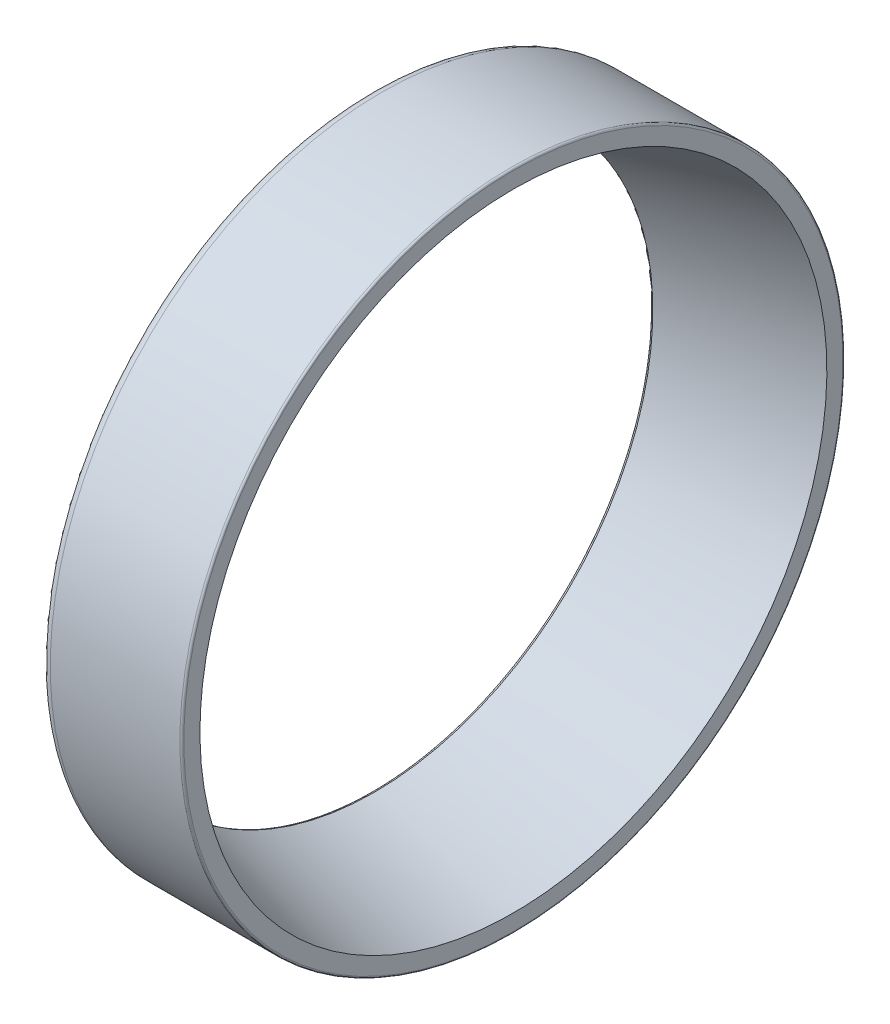
ISO-10303-21;
HEADER;
FILE_DESCRIPTION(('STEP AP214'),'2;1');
FILE_NAME('part.step','',(''),(''),'','','');
FILE_SCHEMA(('AUTOMOTIVE_DESIGN { 1 0 10303 214 1 1 1 1 }'));
ENDSEC;
DATA;
#1=APPLICATION_CONTEXT('core data for automotive mechanical design processes');
#2=APPLICATION_PROTOCOL_DEFINITION('international standard','automotive_design',2000,#1);
#3=PRODUCT_CONTEXT('',#1,'mechanical');
#4=PRODUCT('Part','Part','',(#3));
#5=PRODUCT_RELATED_PRODUCT_CATEGORY('part','',(#4));
#6=PRODUCT_DEFINITION_FORMATION('','',#4);
#7=PRODUCT_DEFINITION_CONTEXT('part definition',#1,'design');
#8=PRODUCT_DEFINITION('design','',#6,#7);
#9=PRODUCT_DEFINITION_SHAPE('','',#8);
#10=(LENGTH_UNIT() NAMED_UNIT(*) SI_UNIT(.MILLI.,.METRE.));
#11=(NAMED_UNIT(*) PLANE_ANGLE_UNIT() SI_UNIT($,.RADIAN.));
#12=(NAMED_UNIT(*) SI_UNIT($,.STERADIAN.) SOLID_ANGLE_UNIT());
#13=UNCERTAINTY_MEASURE_WITH_UNIT(LENGTH_MEASURE(1.E-05),#10,'distance_accuracy_value','');
#14=(GEOMETRIC_REPRESENTATION_CONTEXT(3) GLOBAL_UNCERTAINTY_ASSIGNED_CONTEXT((#13)) GLOBAL_UNIT_ASSIGNED_CONTEXT((#10,
#11,#12)) REPRESENTATION_CONTEXT('',''));
#15=CARTESIAN_POINT('',(0.,0.,0.));
#16=DIRECTION('',(0.,0.,1.));
#17=DIRECTION('',(1.,0.,0.));
#18=AXIS2_PLACEMENT_3D('',#15,#16,#17);
#19=CARTESIAN_POINT('',(0.2,0.,0.));
#20=DIRECTION('',(1.,0.,0.));
#21=DIRECTION('',(0.,0.,-1.));
#22=AXIS2_PLACEMENT_3D('',#19,#20,#21);
#23=TOROIDAL_SURFACE('',#22,28.7446378831043,0.2);
#24=CARTESIAN_POINT('',(0.248949796956785,0.,0.));
#25=DIRECTION('',(1.,0.,0.));
#26=DIRECTION('',(0.,1.,0.));
#27=AXIS2_PLACEMENT_3D('',#24,#25,#26);
#28=CIRCLE('',#27,28.5507205879038);
#29=CARTESIAN_POINT('',(0.248949796956785,28.5507205879038,0.));
#30=VERTEX_POINT('',#29);
#31=EDGE_CURVE('E11',#30,#30,#28,.T.);
#32=ORIENTED_EDGE('',*,*,#31,.T.);
#33=EDGE_LOOP('',(#32));
#34=FACE_BOUND('',#33,.T.);
#35=CARTESIAN_POINT('',(0.,0.,0.));
#36=DIRECTION('',(1.,0.,0.));
#37=DIRECTION('',(0.,1.,0.));
#38=AXIS2_PLACEMENT_3D('',#35,#36,#37);
#39=CIRCLE('',#38,28.7446378831043);
#40=CARTESIAN_POINT('',(0.,28.7446378831043,0.));
#41=VERTEX_POINT('',#40);
#42=EDGE_CURVE('E40',#41,#41,#39,.T.);
#43=ORIENTED_EDGE('',*,*,#42,.F.);
#44=EDGE_LOOP('',(#43));
#45=FACE_BOUND('',#44,.T.);
#46=ADVANCED_FACE('F17',(#34,#45),#23,.T.);
#47=CARTESIAN_POINT('',(7.37447489847839,0.,0.));
#48=DIRECTION('',(1.,0.,0.));
#49=DIRECTION('',(0.,1.,0.));
#50=AXIS2_PLACEMENT_3D('',#47,#48,#49);
#51=CONICAL_SURFACE('',#50,30.3493894821314,0.247260795130037);
#52=CARTESIAN_POINT('',(14.5,0.,0.));
#53=DIRECTION('',(1.,0.,0.));
#54=DIRECTION('',(0.,1.,0.));
#55=AXIS2_PLACEMENT_3D('',#52,#53,#54);
#56=CIRCLE('',#55,32.1480583763591);
#57=CARTESIAN_POINT('',(14.5,32.1480583763591,0.));
#58=VERTEX_POINT('',#57);
#59=EDGE_CURVE('E26',#58,#58,#56,.T.);
#60=ORIENTED_EDGE('',*,*,#59,.T.);
#61=EDGE_LOOP('',(#60));
#62=FACE_BOUND('',#61,.T.);
#63=ORIENTED_EDGE('',*,*,#31,.F.);
#64=EDGE_LOOP('',(#63));
#65=FACE_BOUND('',#64,.T.);
#66=ADVANCED_FACE('F19',(#62,#65),#51,.F.);
#67=CARTESIAN_POINT('',(14.5,32.9740291881795,0.));
#68=DIRECTION('',(1.,0.,0.));
#69=DIRECTION('',(0.,1.,0.));
#70=AXIS2_PLACEMENT_3D('',#67,#68,#69);
#71=PLANE('',#70);
#72=CARTESIAN_POINT('',(14.5,0.,0.));
#73=DIRECTION('',(1.,0.,0.));
#74=DIRECTION('',(0.,1.,0.));
#75=AXIS2_PLACEMENT_3D('',#72,#73,#74);
#76=CIRCLE('',#75,33.8);
#77=CARTESIAN_POINT('',(14.5,33.8,0.));
#78=VERTEX_POINT('',#77);
#79=EDGE_CURVE('E58',#78,#78,#76,.T.);
#80=ORIENTED_EDGE('',*,*,#79,.T.);
#81=EDGE_LOOP('',(#80));
#82=FACE_BOUND('',#81,.T.);
#83=ORIENTED_EDGE('',*,*,#59,.F.);
#84=EDGE_LOOP('',(#83));
#85=FACE_BOUND('',#84,.T.);
#86=ADVANCED_FACE('F83',(#82,#85),#71,.T.);
#87=CARTESIAN_POINT('',(14.3,0.,0.));
#88=DIRECTION('',(1.,0.,0.));
#89=DIRECTION('',(0.,0.,-1.));
#90=AXIS2_PLACEMENT_3D('',#87,#88,#89);
#91=TOROIDAL_SURFACE('',#90,33.8,0.2);
#92=CARTESIAN_POINT('',(14.3,0.,0.));
#93=DIRECTION('',(1.,0.,0.));
#94=DIRECTION('',(0.,1.,0.));
#95=AXIS2_PLACEMENT_3D('',#92,#93,#94);
#96=CIRCLE('',#95,34.);
#97=CARTESIAN_POINT('',(14.3,34.,0.));
#98=VERTEX_POINT('',#97);
#99=EDGE_CURVE('E56',#98,#98,#96,.T.);
#100=ORIENTED_EDGE('',*,*,#99,.T.);
#101=EDGE_LOOP('',(#100));
#102=FACE_BOUND('',#101,.T.);
#103=ORIENTED_EDGE('',*,*,#79,.F.);
#104=EDGE_LOOP('',(#103));
#105=FACE_BOUND('',#104,.T.);
#106=ADVANCED_FACE('F76',(#102,#105),#91,.T.);
#107=CARTESIAN_POINT('',(7.65,0.,0.));
#108=DIRECTION('',(-1.,0.,0.));
#109=DIRECTION('',(0.,1.,0.));
#110=AXIS2_PLACEMENT_3D('',#107,#108,#109);
#111=CYLINDRICAL_SURFACE('',#110,34.);
#112=CARTESIAN_POINT('',(1.,0.,0.));
#113=DIRECTION('',(1.,0.,0.));
#114=DIRECTION('',(0.,1.,0.));
#115=AXIS2_PLACEMENT_3D('',#112,#113,#114);
#116=CIRCLE('',#115,34.);
#117=CARTESIAN_POINT('',(1.,34.,0.));
#118=VERTEX_POINT('',#117);
#119=EDGE_CURVE('E52',#118,#118,#116,.T.);
#120=ORIENTED_EDGE('',*,*,#119,.T.);
#121=EDGE_LOOP('',(#120));
#122=FACE_BOUND('',#121,.T.);
#123=ORIENTED_EDGE('',*,*,#99,.F.);
#124=EDGE_LOOP('',(#123));
#125=FACE_BOUND('',#124,.T.);
#126=ADVANCED_FACE('F65',(#122,#125),#111,.T.);
#127=CARTESIAN_POINT('',(1.,0.,0.));
#128=DIRECTION('',(1.,0.,0.));
#129=DIRECTION('',(0.,0.,-1.));
#130=AXIS2_PLACEMENT_3D('',#127,#128,#129);
#131=TOROIDAL_SURFACE('',#130,33.,1.);
#132=CARTESIAN_POINT('',(0.,0.,0.));
#133=DIRECTION('',(1.,0.,0.));
#134=DIRECTION('',(0.,1.,0.));
#135=AXIS2_PLACEMENT_3D('',#132,#133,#134);
#136=CIRCLE('',#135,33.);
#137=CARTESIAN_POINT('',(0.,33.,0.));
#138=VERTEX_POINT('',#137);
#139=EDGE_CURVE('E47',#138,#138,#136,.T.);
#140=ORIENTED_EDGE('',*,*,#139,.T.);
#141=EDGE_LOOP('',(#140));
#142=FACE_BOUND('',#141,.T.);
#143=ORIENTED_EDGE('',*,*,#119,.F.);
#144=EDGE_LOOP('',(#143));
#145=FACE_BOUND('',#144,.T.);
#146=ADVANCED_FACE('F48',(#142,#145),#131,.T.);
#147=CARTESIAN_POINT('',(0.,30.8723189415522,0.));
#148=DIRECTION('',(-1.,0.,0.));
#149=DIRECTION('',(0.,-1.,0.));
#150=AXIS2_PLACEMENT_3D('',#147,#148,#149);
#151=PLANE('',#150);
#152=ORIENTED_EDGE('',*,*,#42,.T.);
#153=EDGE_LOOP('',(#152));
#154=FACE_BOUND('',#153,.T.);
#155=ORIENTED_EDGE('',*,*,#139,.F.);
#156=EDGE_LOOP('',(#155));
#157=FACE_BOUND('',#156,.T.);
#158=ADVANCED_FACE('F68',(#154,#157),#151,.T.);
#159=CLOSED_SHELL('',(#46,#66,#86,#106,#126,#146,#158));
#160=MANIFOLD_SOLID_BREP('B1',#159);
#161=ADVANCED_BREP_SHAPE_REPRESENTATION('',(#18,#160),#14);
#162=SHAPE_DEFINITION_REPRESENTATION(#9,#161);
ENDSEC;
END-ISO-10303-21;
